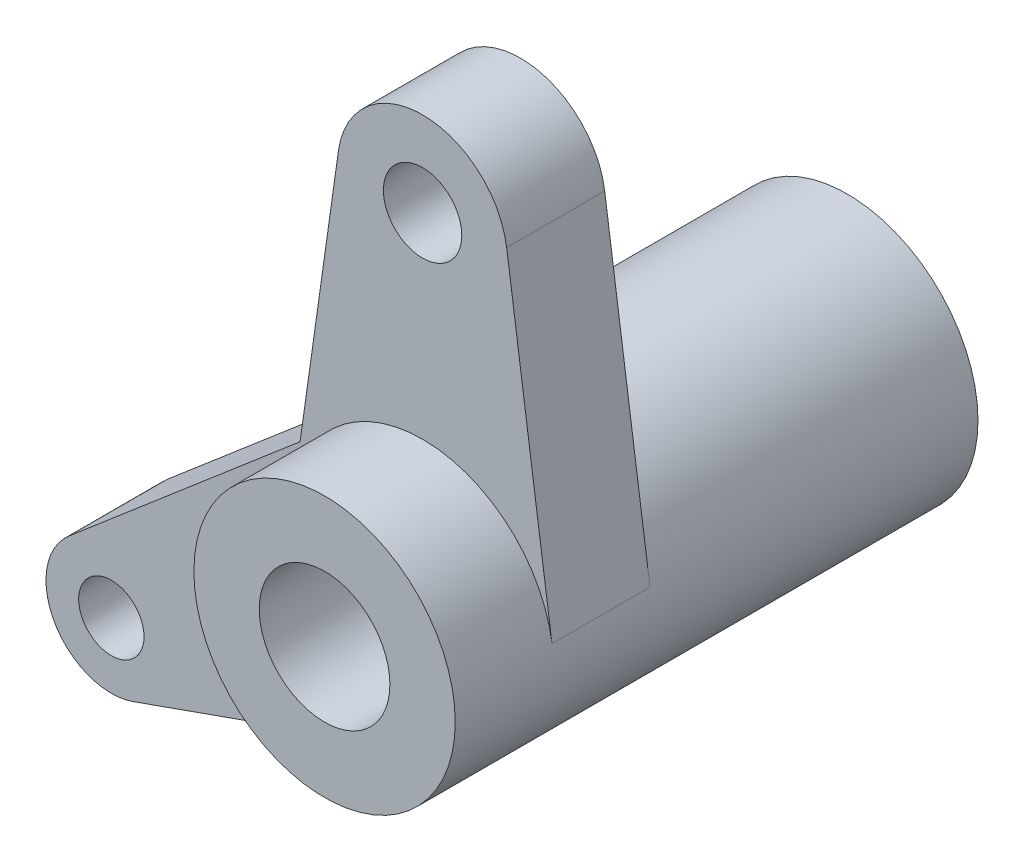
ISO-10303-21;
HEADER;
FILE_DESCRIPTION(('STEP AP214'),'2;1');
FILE_NAME('part.step','',(''),(''),'','','');
FILE_SCHEMA(('AUTOMOTIVE_DESIGN { 1 0 10303 214 1 1 1 1 }'));
ENDSEC;
DATA;
#1=APPLICATION_CONTEXT('core data for automotive mechanical design processes');
#2=APPLICATION_PROTOCOL_DEFINITION('international standard','automotive_design',2000,#1);
#3=PRODUCT_CONTEXT('',#1,'mechanical');
#4=PRODUCT('Part','Part','',(#3));
#5=PRODUCT_RELATED_PRODUCT_CATEGORY('part','',(#4));
#6=PRODUCT_DEFINITION_FORMATION('','',#4);
#7=PRODUCT_DEFINITION_CONTEXT('part definition',#1,'design');
#8=PRODUCT_DEFINITION('design','',#6,#7);
#9=PRODUCT_DEFINITION_SHAPE('','',#8);
#10=(LENGTH_UNIT() NAMED_UNIT(*) SI_UNIT(.MILLI.,.METRE.));
#11=(NAMED_UNIT(*) PLANE_ANGLE_UNIT() SI_UNIT($,.RADIAN.));
#12=(NAMED_UNIT(*) SI_UNIT($,.STERADIAN.) SOLID_ANGLE_UNIT());
#13=UNCERTAINTY_MEASURE_WITH_UNIT(LENGTH_MEASURE(1.E-05),#10,'distance_accuracy_value','');
#14=(GEOMETRIC_REPRESENTATION_CONTEXT(3) GLOBAL_UNCERTAINTY_ASSIGNED_CONTEXT((#13)) GLOBAL_UNIT_ASSIGNED_CONTEXT((#10,
#11,#12)) REPRESENTATION_CONTEXT('',''));
#15=CARTESIAN_POINT('',(0.,0.,0.));
#16=DIRECTION('',(0.,0.,1.));
#17=DIRECTION('',(1.,0.,0.));
#18=AXIS2_PLACEMENT_3D('',#15,#16,#17);
#19=CARTESIAN_POINT('',(0.,0.,-80.0000000000001));
#20=DIRECTION('',(0.,0.,1.));
#21=DIRECTION('',(1.,0.,0.));
#22=AXIS2_PLACEMENT_3D('',#19,#20,#21);
#23=CYLINDRICAL_SURFACE('',#22,20.);
#24=CARTESIAN_POINT('',(0.,0.,0.));
#25=DIRECTION('',(0.,0.,1.));
#26=DIRECTION('',(1.,0.,0.));
#27=AXIS2_PLACEMENT_3D('',#24,#25,#26);
#28=CIRCLE('',#27,20.);
#29=CARTESIAN_POINT('',(20.,0.,0.));
#30=VERTEX_POINT('',#29);
#31=EDGE_CURVE('E53',#30,#30,#28,.T.);
#32=ORIENTED_EDGE('',*,*,#31,.F.);
#33=EDGE_LOOP('',(#32));
#34=FACE_BOUND('',#33,.T.);
#35=CARTESIAN_POINT('',(0.,0.,-80.0000000000001));
#36=DIRECTION('',(0.,0.,1.));
#37=DIRECTION('',(1.,0.,0.));
#38=AXIS2_PLACEMENT_3D('',#35,#36,#37);
#39=CIRCLE('',#38,20.);
#40=CARTESIAN_POINT('',(20.,0.,-80.0000000000001));
#41=VERTEX_POINT('',#40);
#42=EDGE_CURVE('E13',#41,#41,#39,.T.);
#43=ORIENTED_EDGE('',*,*,#42,.T.);
#44=EDGE_LOOP('',(#43));
#45=FACE_BOUND('',#44,.T.);
#46=DIRECTION('',(0.,0.,1.));
#47=VECTOR('',#46,1.);
#48=CARTESIAN_POINT('',(6.68413837386756,-18.8499945410865,-30.));
#49=LINE('',#48,#47);
#50=CARTESIAN_POINT('',(6.68413837386756,-18.8499945410865,-30.));
#51=VERTEX_POINT('',#50);
#52=CARTESIAN_POINT('',(6.68413837386756,-18.8499945410865,-15.));
#53=VERTEX_POINT('',#52);
#54=EDGE_CURVE('E71',#51,#53,#49,.T.);
#55=ORIENTED_EDGE('',*,*,#54,.F.);
#56=CARTESIAN_POINT('',(0.,0.,-30.));
#57=DIRECTION('',(0.,0.,1.));
#58=DIRECTION('',(1.,0.,0.));
#59=AXIS2_PLACEMENT_3D('',#56,#57,#58);
#60=CIRCLE('',#59,20.);
#61=CARTESIAN_POINT('',(19.8030300711785,2.8,-30.));
#62=VERTEX_POINT('',#61);
#63=EDGE_CURVE('E66',#62,#51,#60,.T.);
#64=ORIENTED_EDGE('',*,*,#63,.F.);
#65=DIRECTION('',(0.,0.,1.));
#66=VECTOR('',#65,1.);
#67=CARTESIAN_POINT('',(19.8030300711785,2.8,-30.));
#68=LINE('',#67,#66);
#69=CARTESIAN_POINT('',(19.8030300711785,2.8,-15.));
#70=VERTEX_POINT('',#69);
#71=EDGE_CURVE('E124',#62,#70,#68,.T.);
#72=ORIENTED_EDGE('',*,*,#71,.T.);
#73=CARTESIAN_POINT('',(0.,0.,-15.));
#74=DIRECTION('',(0.,0.,1.));
#75=DIRECTION('',(1.,0.,0.));
#76=AXIS2_PLACEMENT_3D('',#73,#74,#75);
#77=CIRCLE('',#76,20.);
#78=EDGE_CURVE('E165',#70,#53,#77,.T.);
#79=ORIENTED_EDGE('',*,*,#78,.T.);
#80=EDGE_LOOP('',(#55,#64,#72,#79));
#81=FACE_BOUND('',#80,.T.);
#82=ADVANCED_FACE('F49',(#34,#45,#81),#23,.T.);
#83=CARTESIAN_POINT('',(0.,0.,-80.0000000000001));
#84=DIRECTION('',(0.,0.,1.));
#85=DIRECTION('',(1.,0.,0.));
#86=AXIS2_PLACEMENT_3D('',#83,#84,#85);
#87=CYLINDRICAL_SURFACE('',#86,10.);
#88=CARTESIAN_POINT('',(0.,0.,-80.0000000000001));
#89=DIRECTION('',(0.,0.,1.));
#90=DIRECTION('',(1.,0.,0.));
#91=AXIS2_PLACEMENT_3D('',#88,#89,#90);
#92=CIRCLE('',#91,10.);
#93=CARTESIAN_POINT('',(10.,0.,-80.0000000000001));
#94=VERTEX_POINT('',#93);
#95=EDGE_CURVE('E58',#94,#94,#92,.T.);
#96=ORIENTED_EDGE('',*,*,#95,.F.);
#97=EDGE_LOOP('',(#96));
#98=FACE_BOUND('',#97,.T.);
#99=CARTESIAN_POINT('',(0.,0.,0.));
#100=DIRECTION('',(0.,0.,1.));
#101=DIRECTION('',(1.,0.,0.));
#102=AXIS2_PLACEMENT_3D('',#99,#100,#101);
#103=CIRCLE('',#102,10.);
#104=CARTESIAN_POINT('',(10.,0.,0.));
#105=VERTEX_POINT('',#104);
#106=EDGE_CURVE('E173',#105,#105,#103,.T.);
#107=ORIENTED_EDGE('',*,*,#106,.T.);
#108=EDGE_LOOP('',(#107));
#109=FACE_BOUND('',#108,.T.);
#110=ADVANCED_FACE('F51',(#98,#109),#87,.F.);
#111=CARTESIAN_POINT('',(0.,0.,-80.0000000000001));
#112=DIRECTION('',(0.,0.,1.));
#113=DIRECTION('',(1.,0.,0.));
#114=AXIS2_PLACEMENT_3D('',#111,#112,#113);
#115=PLANE('',#114);
#116=ORIENTED_EDGE('',*,*,#95,.T.);
#117=EDGE_LOOP('',(#116));
#118=FACE_BOUND('',#117,.T.);
#119=ORIENTED_EDGE('',*,*,#42,.F.);
#120=EDGE_LOOP('',(#119));
#121=FACE_BOUND('',#120,.T.);
#122=ADVANCED_FACE('F195',(#118,#121),#115,.F.);
#123=CARTESIAN_POINT('',(0.,0.,0.));
#124=DIRECTION('',(0.,0.,1.));
#125=DIRECTION('',(1.,0.,0.));
#126=AXIS2_PLACEMENT_3D('',#123,#124,#125);
#127=PLANE('',#126);
#128=ORIENTED_EDGE('',*,*,#106,.F.);
#129=EDGE_LOOP('',(#128));
#130=FACE_BOUND('',#129,.T.);
#131=ORIENTED_EDGE('',*,*,#31,.T.);
#132=EDGE_LOOP('',(#131));
#133=FACE_BOUND('',#132,.T.);
#134=ADVANCED_FACE('F189',(#130,#133),#127,.T.);
#135=CARTESIAN_POINT('',(19.8030300711785,2.8,-30.));
#136=DIRECTION('',(-0.990151503558925,-0.14,0.));
#137=DIRECTION('',(0.14,-0.990151503558925,0.));
#138=AXIS2_PLACEMENT_3D('',#135,#136,#137);
#139=PLANE('',#138);
#140=DIRECTION('',(0.14,-0.990151503558925,0.));
#141=VECTOR('',#140,1.);
#142=CARTESIAN_POINT('',(19.8030300711785,2.8,-15.));
#143=LINE('',#142,#141);
#144=CARTESIAN_POINT('',(12.871969546266,51.82,-15.));
#145=VERTEX_POINT('',#144);
#146=EDGE_CURVE('E150',#145,#70,#143,.T.);
#147=ORIENTED_EDGE('',*,*,#146,.T.);
#148=ORIENTED_EDGE('',*,*,#71,.F.);
#149=DIRECTION('',(0.14,-0.990151503558925,0.));
#150=VECTOR('',#149,1.);
#151=CARTESIAN_POINT('',(19.8030300711785,2.8,-30.));
#152=LINE('',#151,#150);
#153=CARTESIAN_POINT('',(12.871969546266,51.82,-30.));
#154=VERTEX_POINT('',#153);
#155=EDGE_CURVE('E122',#154,#62,#152,.T.);
#156=ORIENTED_EDGE('',*,*,#155,.F.);
#157=DIRECTION('',(0.,0.,1.));
#158=VECTOR('',#157,1.);
#159=CARTESIAN_POINT('',(12.871969546266,51.82,-30.));
#160=LINE('',#159,#158);
#161=EDGE_CURVE('E108',#154,#145,#160,.T.);
#162=ORIENTED_EDGE('',*,*,#161,.T.);
#163=EDGE_LOOP('',(#147,#148,#156,#162));
#164=FACE_BOUND('',#163,.T.);
#165=ADVANCED_FACE('F123',(#164),#139,.F.);
#166=CARTESIAN_POINT('',(6.68413837386756,-18.8499945410865,-30.));
#167=DIRECTION('',(0.334206918693378,-0.942499727054325,0.));
#168=DIRECTION('',(0.942499727054326,0.334206918693378,0.));
#169=AXIS2_PLACEMENT_3D('',#166,#167,#168);
#170=PLANE('',#169);
#171=DIRECTION('',(0.942499727054326,0.334206918693378,0.));
#172=VECTOR('',#171,1.);
#173=CARTESIAN_POINT('',(6.68413837386756,-18.8499945410865,-15.));
#174=LINE('',#173,#172);
#175=CARTESIAN_POINT('',(-44.2893280212102,-36.9249972705435,-15.));
#176=VERTEX_POINT('',#175);
#177=EDGE_CURVE('E162',#176,#53,#174,.T.);
#178=ORIENTED_EDGE('',*,*,#177,.F.);
#179=DIRECTION('',(0.,0.,1.));
#180=VECTOR('',#179,1.);
#181=CARTESIAN_POINT('',(-44.2893280212102,-36.9249972705435,-30.));
#182=LINE('',#181,#180);
#183=CARTESIAN_POINT('',(-44.2893280212102,-36.9249972705435,-30.));
#184=VERTEX_POINT('',#183);
#185=EDGE_CURVE('E175',#184,#176,#182,.T.);
#186=ORIENTED_EDGE('',*,*,#185,.F.);
#187=DIRECTION('',(0.942499727054326,0.334206918693378,0.));
#188=VECTOR('',#187,1.);
#189=CARTESIAN_POINT('',(6.68413837386756,-18.8499945410865,-30.));
#190=LINE('',#189,#188);
#191=EDGE_CURVE('E141',#184,#51,#190,.T.);
#192=ORIENTED_EDGE('',*,*,#191,.T.);
#193=ORIENTED_EDGE('',*,*,#54,.T.);
#194=EDGE_LOOP('',(#178,#186,#192,#193));
#195=FACE_BOUND('',#194,.T.);
#196=ADVANCED_FACE('F209',(#195),#170,.T.);
#197=CARTESIAN_POINT('',(-47.631397208144,-27.5000000000002,-30.));
#198=DIRECTION('',(0.,0.,1.));
#199=DIRECTION('',(1.,0.,0.));
#200=AXIS2_PLACEMENT_3D('',#197,#198,#199);
#201=CYLINDRICAL_SURFACE('',#200,10.);
#202=CARTESIAN_POINT('',(-47.631397208144,-27.5000000000002,-15.));
#203=DIRECTION('',(0.,0.,1.));
#204=DIRECTION('',(1.,0.,0.));
#205=AXIS2_PLACEMENT_3D('',#202,#203,#204);
#206=CIRCLE('',#205,10.);
#207=CARTESIAN_POINT('',(-54.1226496815666,-19.8931845476388,-15.));
#208=VERTEX_POINT('',#207);
#209=EDGE_CURVE('E159',#208,#176,#206,.T.);
#210=ORIENTED_EDGE('',*,*,#209,.F.);
#211=DIRECTION('',(0.,0.,1.));
#212=VECTOR('',#211,1.);
#213=CARTESIAN_POINT('',(-54.1226496815666,-19.8931845476388,-30.));
#214=LINE('',#213,#212);
#215=CARTESIAN_POINT('',(-54.1226496815666,-19.8931845476388,-30.));
#216=VERTEX_POINT('',#215);
#217=EDGE_CURVE('E177',#216,#208,#214,.T.);
#218=ORIENTED_EDGE('',*,*,#217,.F.);
#219=CARTESIAN_POINT('',(-47.631397208144,-27.5000000000002,-30.));
#220=DIRECTION('',(0.,0.,1.));
#221=DIRECTION('',(1.,0.,0.));
#222=AXIS2_PLACEMENT_3D('',#219,#220,#221);
#223=CIRCLE('',#222,10.);
#224=EDGE_CURVE('E138',#216,#184,#223,.T.);
#225=ORIENTED_EDGE('',*,*,#224,.T.);
#226=ORIENTED_EDGE('',*,*,#185,.T.);
#227=EDGE_LOOP('',(#210,#218,#225,#226));
#228=FACE_BOUND('',#227,.T.);
#229=ADVANCED_FACE('F221',(#228),#201,.T.);
#230=CARTESIAN_POINT('',(-12.9825049468453,15.2136309047228,-30.));
#231=DIRECTION('',(0.649125247342264,-0.760681545236142,0.));
#232=DIRECTION('',(0.760681545236142,0.649125247342264,0.));
#233=AXIS2_PLACEMENT_3D('',#230,#231,#232);
#234=PLANE('',#233);
#235=DIRECTION('',(0.760681545236142,0.649125247342264,0.));
#236=VECTOR('',#235,1.);
#237=CARTESIAN_POINT('',(-12.9825049468453,15.2136309047228,-15.));
#238=LINE('',#237,#236);
#239=CARTESIAN_POINT('',(-18.7428623321401,10.2980477202399,-15.));
#240=VERTEX_POINT('',#239);
#241=EDGE_CURVE('E156',#208,#240,#238,.T.);
#242=ORIENTED_EDGE('',*,*,#241,.T.);
#243=DIRECTION('',(0.,0.,1.));
#244=VECTOR('',#243,1.);
#245=CARTESIAN_POINT('',(-18.7428623321401,10.2980477202399,-30.));
#246=LINE('',#245,#244);
#247=CARTESIAN_POINT('',(-18.7428623321401,10.2980477202399,-30.));
#248=VERTEX_POINT('',#247);
#249=EDGE_CURVE('E179',#248,#240,#246,.T.);
#250=ORIENTED_EDGE('',*,*,#249,.F.);
#251=DIRECTION('',(0.760681545236142,0.649125247342264,0.));
#252=VECTOR('',#251,1.);
#253=CARTESIAN_POINT('',(-12.9825049468453,15.2136309047228,-30.));
#254=LINE('',#253,#252);
#255=EDGE_CURVE('E134',#216,#248,#254,.T.);
#256=ORIENTED_EDGE('',*,*,#255,.F.);
#257=ORIENTED_EDGE('',*,*,#217,.T.);
#258=EDGE_LOOP('',(#242,#250,#256,#257));
#259=FACE_BOUND('',#258,.T.);
#260=ADVANCED_FACE('F217',(#259),#234,.F.);
#261=CARTESIAN_POINT('',(-19.8030300711785,2.8,-30.));
#262=DIRECTION('',(-0.990151503558925,0.14,0.));
#263=DIRECTION('',(-0.14,-0.990151503558925,0.));
#264=AXIS2_PLACEMENT_3D('',#261,#262,#263);
#265=PLANE('',#264);
#266=DIRECTION('',(-0.14,-0.990151503558925,0.));
#267=VECTOR('',#266,1.);
#268=CARTESIAN_POINT('',(-19.8030300711785,2.8,-15.));
#269=LINE('',#268,#267);
#270=CARTESIAN_POINT('',(-12.871969546266,51.82,-15.));
#271=VERTEX_POINT('',#270);
#272=EDGE_CURVE('E153',#271,#240,#269,.T.);
#273=ORIENTED_EDGE('',*,*,#272,.F.);
#274=DIRECTION('',(0.,0.,1.));
#275=VECTOR('',#274,1.);
#276=CARTESIAN_POINT('',(-12.871969546266,51.82,-30.));
#277=LINE('',#276,#275);
#278=CARTESIAN_POINT('',(-12.871969546266,51.82,-30.));
#279=VERTEX_POINT('',#278);
#280=EDGE_CURVE('E118',#279,#271,#277,.T.);
#281=ORIENTED_EDGE('',*,*,#280,.F.);
#282=DIRECTION('',(-0.14,-0.990151503558925,0.));
#283=VECTOR('',#282,1.);
#284=CARTESIAN_POINT('',(-19.8030300711785,2.8,-30.));
#285=LINE('',#284,#283);
#286=EDGE_CURVE('E132',#279,#248,#285,.T.);
#287=ORIENTED_EDGE('',*,*,#286,.T.);
#288=ORIENTED_EDGE('',*,*,#249,.T.);
#289=EDGE_LOOP('',(#273,#281,#287,#288));
#290=FACE_BOUND('',#289,.T.);
#291=ADVANCED_FACE('F214',(#290),#265,.T.);
#292=CARTESIAN_POINT('',(0.,50.,-30.));
#293=DIRECTION('',(0.,0.,1.));
#294=DIRECTION('',(1.,0.,0.));
#295=AXIS2_PLACEMENT_3D('',#292,#293,#294);
#296=CYLINDRICAL_SURFACE('',#295,6.);
#297=CARTESIAN_POINT('',(0.,50.,-30.));
#298=DIRECTION('',(0.,0.,1.));
#299=DIRECTION('',(1.,0.,0.));
#300=AXIS2_PLACEMENT_3D('',#297,#298,#299);
#301=CIRCLE('',#300,6.);
#302=CARTESIAN_POINT('',(6.,50.,-30.));
#303=VERTEX_POINT('',#302);
#304=EDGE_CURVE('E145',#303,#303,#301,.T.);
#305=ORIENTED_EDGE('',*,*,#304,.F.);
#306=EDGE_LOOP('',(#305));
#307=FACE_BOUND('',#306,.T.);
#308=CARTESIAN_POINT('',(0.,50.,-15.));
#309=DIRECTION('',(0.,0.,1.));
#310=DIRECTION('',(1.,0.,0.));
#311=AXIS2_PLACEMENT_3D('',#308,#309,#310);
#312=CIRCLE('',#311,6.);
#313=CARTESIAN_POINT('',(6.,50.,-15.));
#314=VERTEX_POINT('',#313);
#315=EDGE_CURVE('E167',#314,#314,#312,.T.);
#316=ORIENTED_EDGE('',*,*,#315,.T.);
#317=EDGE_LOOP('',(#316));
#318=FACE_BOUND('',#317,.T.);
#319=ADVANCED_FACE('F213',(#307,#318),#296,.F.);
#320=CARTESIAN_POINT('',(0.,50.,-30.));
#321=DIRECTION('',(0.,0.,1.));
#322=DIRECTION('',(1.,0.,0.));
#323=AXIS2_PLACEMENT_3D('',#320,#321,#322);
#324=CYLINDRICAL_SURFACE('',#323,13.);
#325=CARTESIAN_POINT('',(0.,50.,-15.));
#326=DIRECTION('',(0.,0.,1.));
#327=DIRECTION('',(1.,0.,0.));
#328=AXIS2_PLACEMENT_3D('',#325,#326,#327);
#329=CIRCLE('',#328,13.);
#330=EDGE_CURVE('E114',#145,#271,#329,.T.);
#331=ORIENTED_EDGE('',*,*,#330,.F.);
#332=ORIENTED_EDGE('',*,*,#161,.F.);
#333=CARTESIAN_POINT('',(0.,50.,-30.));
#334=DIRECTION('',(0.,0.,1.));
#335=DIRECTION('',(1.,0.,0.));
#336=AXIS2_PLACEMENT_3D('',#333,#334,#335);
#337=CIRCLE('',#336,13.);
#338=EDGE_CURVE('E112',#154,#279,#337,.T.);
#339=ORIENTED_EDGE('',*,*,#338,.T.);
#340=ORIENTED_EDGE('',*,*,#280,.T.);
#341=EDGE_LOOP('',(#331,#332,#339,#340));
#342=FACE_BOUND('',#341,.T.);
#343=ADVANCED_FACE('F110',(#342),#324,.T.);
#344=CARTESIAN_POINT('',(-47.631397208144,-27.5000000000002,-30.));
#345=DIRECTION('',(0.,0.,1.));
#346=DIRECTION('',(1.,0.,0.));
#347=AXIS2_PLACEMENT_3D('',#344,#345,#346);
#348=CYLINDRICAL_SURFACE('',#347,5.);
#349=CARTESIAN_POINT('',(-47.631397208144,-27.5000000000002,-30.));
#350=DIRECTION('',(0.,0.,1.));
#351=DIRECTION('',(1.,0.,0.));
#352=AXIS2_PLACEMENT_3D('',#349,#350,#351);
#353=CIRCLE('',#352,5.);
#354=CARTESIAN_POINT('',(-42.631397208144,-27.5000000000002,-30.));
#355=VERTEX_POINT('',#354);
#356=EDGE_CURVE('E119',#355,#355,#353,.T.);
#357=ORIENTED_EDGE('',*,*,#356,.F.);
#358=EDGE_LOOP('',(#357));
#359=FACE_BOUND('',#358,.T.);
#360=CARTESIAN_POINT('',(-47.631397208144,-27.5000000000002,-15.));
#361=DIRECTION('',(0.,0.,1.));
#362=DIRECTION('',(1.,0.,0.));
#363=AXIS2_PLACEMENT_3D('',#360,#361,#362);
#364=CIRCLE('',#363,5.);
#365=CARTESIAN_POINT('',(-42.631397208144,-27.5000000000002,-15.));
#366=VERTEX_POINT('',#365);
#367=EDGE_CURVE('E126',#366,#366,#364,.T.);
#368=ORIENTED_EDGE('',*,*,#367,.T.);
#369=EDGE_LOOP('',(#368));
#370=FACE_BOUND('',#369,.T.);
#371=ADVANCED_FACE('F212',(#359,#370),#348,.F.);
#372=CARTESIAN_POINT('',(0.,0.,-30.));
#373=DIRECTION('',(0.,0.,1.));
#374=DIRECTION('',(1.,0.,0.));
#375=AXIS2_PLACEMENT_3D('',#372,#373,#374);
#376=PLANE('',#375);
#377=ORIENTED_EDGE('',*,*,#155,.T.);
#378=ORIENTED_EDGE('',*,*,#63,.T.);
#379=ORIENTED_EDGE('',*,*,#191,.F.);
#380=ORIENTED_EDGE('',*,*,#224,.F.);
#381=ORIENTED_EDGE('',*,*,#255,.T.);
#382=ORIENTED_EDGE('',*,*,#286,.F.);
#383=ORIENTED_EDGE('',*,*,#338,.F.);
#384=EDGE_LOOP('',(#377,#378,#379,#380,#381,#382,#383));
#385=FACE_BOUND('',#384,.T.);
#386=ORIENTED_EDGE('',*,*,#304,.T.);
#387=EDGE_LOOP('',(#386));
#388=FACE_BOUND('',#387,.T.);
#389=ORIENTED_EDGE('',*,*,#356,.T.);
#390=EDGE_LOOP('',(#389));
#391=FACE_BOUND('',#390,.T.);
#392=ADVANCED_FACE('F129',(#385,#388,#391),#376,.F.);
#393=CARTESIAN_POINT('',(0.,0.,-15.));
#394=DIRECTION('',(0.,0.,1.));
#395=DIRECTION('',(1.,0.,0.));
#396=AXIS2_PLACEMENT_3D('',#393,#394,#395);
#397=PLANE('',#396);
#398=ORIENTED_EDGE('',*,*,#146,.F.);
#399=ORIENTED_EDGE('',*,*,#330,.T.);
#400=ORIENTED_EDGE('',*,*,#272,.T.);
#401=ORIENTED_EDGE('',*,*,#241,.F.);
#402=ORIENTED_EDGE('',*,*,#209,.T.);
#403=ORIENTED_EDGE('',*,*,#177,.T.);
#404=ORIENTED_EDGE('',*,*,#78,.F.);
#405=EDGE_LOOP('',(#398,#399,#400,#401,#402,#403,#404));
#406=FACE_BOUND('',#405,.T.);
#407=ORIENTED_EDGE('',*,*,#315,.F.);
#408=EDGE_LOOP('',(#407));
#409=FACE_BOUND('',#408,.T.);
#410=ORIENTED_EDGE('',*,*,#367,.F.);
#411=EDGE_LOOP('',(#410));
#412=FACE_BOUND('',#411,.T.);
#413=ADVANCED_FACE('F235',(#406,#409,#412),#397,.T.);
#414=CLOSED_SHELL('',(#82,#110,#122,#134,#165,#196,#229,#260,#291,#319,#343,#371,#392,#413));
#415=MANIFOLD_SOLID_BREP('B2',#414);
#416=ADVANCED_BREP_SHAPE_REPRESENTATION('',(#18,#415),#14);
#417=SHAPE_DEFINITION_REPRESENTATION(#9,#416);
ENDSEC;
END-ISO-10303-21;
